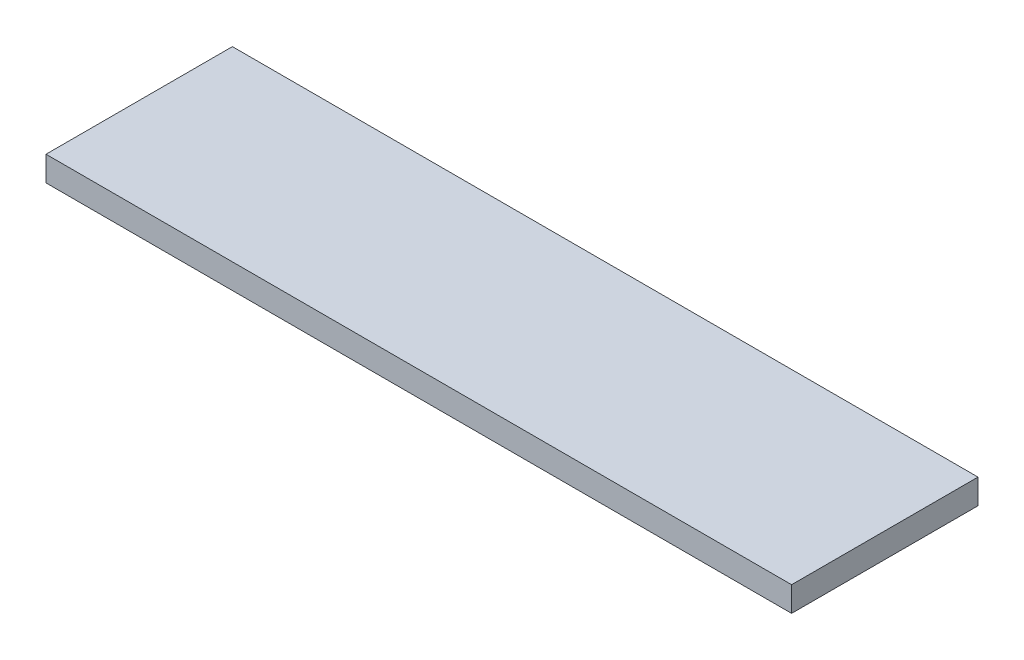
ISO-10303-21;
HEADER;
FILE_DESCRIPTION(('STEP AP214'),'2;1');
FILE_NAME('part.step','',(''),(''),'','','');
FILE_SCHEMA(('AUTOMOTIVE_DESIGN { 1 0 10303 214 1 1 1 1 }'));
ENDSEC;
DATA;
#1=APPLICATION_CONTEXT('core data for automotive mechanical design processes');
#2=APPLICATION_PROTOCOL_DEFINITION('international standard','automotive_design',2000,#1);
#3=PRODUCT_CONTEXT('',#1,'mechanical');
#4=PRODUCT('Part','Part','',(#3));
#5=PRODUCT_RELATED_PRODUCT_CATEGORY('part','',(#4));
#6=PRODUCT_DEFINITION_FORMATION('','',#4);
#7=PRODUCT_DEFINITION_CONTEXT('part definition',#1,'design');
#8=PRODUCT_DEFINITION('design','',#6,#7);
#9=PRODUCT_DEFINITION_SHAPE('','',#8);
#10=(LENGTH_UNIT() NAMED_UNIT(*) SI_UNIT(.MILLI.,.METRE.));
#11=(NAMED_UNIT(*) PLANE_ANGLE_UNIT() SI_UNIT($,.RADIAN.));
#12=(NAMED_UNIT(*) SI_UNIT($,.STERADIAN.) SOLID_ANGLE_UNIT());
#13=UNCERTAINTY_MEASURE_WITH_UNIT(LENGTH_MEASURE(1.E-05),#10,'distance_accuracy_value','');
#14=(GEOMETRIC_REPRESENTATION_CONTEXT(3) GLOBAL_UNCERTAINTY_ASSIGNED_CONTEXT((#13)) GLOBAL_UNIT_ASSIGNED_CONTEXT((#10,
#11,#12)) REPRESENTATION_CONTEXT('',''));
#15=CARTESIAN_POINT('',(0.,0.,0.));
#16=DIRECTION('',(0.,0.,1.));
#17=DIRECTION('',(1.,0.,0.));
#18=AXIS2_PLACEMENT_3D('',#15,#16,#17);
#19=CARTESIAN_POINT('',(30.,2.,7.5));
#20=DIRECTION('',(-1.,0.,0.));
#21=DIRECTION('',(0.,0.,1.));
#22=AXIS2_PLACEMENT_3D('',#19,#20,#21);
#23=PLANE('',#22);
#24=DIRECTION('',(0.,0.,-1.));
#25=VECTOR('',#24,1.);
#26=CARTESIAN_POINT('',(30.,0.,7.5));
#27=LINE('',#26,#25);
#28=CARTESIAN_POINT('',(30.,0.,7.5));
#29=VERTEX_POINT('',#28);
#30=CARTESIAN_POINT('',(30.,0.,-7.5));
#31=VERTEX_POINT('',#30);
#32=EDGE_CURVE('E113',#29,#31,#27,.T.);
#33=ORIENTED_EDGE('',*,*,#32,.T.);
#34=DIRECTION('',(0.,-1.,0.));
#35=VECTOR('',#34,1.);
#36=CARTESIAN_POINT('',(30.,2.,-7.5));
#37=LINE('',#36,#35);
#38=CARTESIAN_POINT('',(30.,2.,-7.5));
#39=VERTEX_POINT('',#38);
#40=EDGE_CURVE('E11',#39,#31,#37,.T.);
#41=ORIENTED_EDGE('',*,*,#40,.F.);
#42=DIRECTION('',(0.,0.,-1.));
#43=VECTOR('',#42,1.);
#44=CARTESIAN_POINT('',(30.,2.,7.5));
#45=LINE('',#44,#43);
#46=CARTESIAN_POINT('',(30.,2.,7.5));
#47=VERTEX_POINT('',#46);
#48=EDGE_CURVE('E97',#47,#39,#45,.T.);
#49=ORIENTED_EDGE('',*,*,#48,.F.);
#50=DIRECTION('',(0.,-1.,0.));
#51=VECTOR('',#50,1.);
#52=CARTESIAN_POINT('',(30.,2.,7.5));
#53=LINE('',#52,#51);
#54=EDGE_CURVE('E109',#47,#29,#53,.T.);
#55=ORIENTED_EDGE('',*,*,#54,.T.);
#56=EDGE_LOOP('',(#33,#41,#49,#55));
#57=FACE_BOUND('',#56,.T.);
#58=ADVANCED_FACE('F45',(#57),#23,.F.);
#59=CARTESIAN_POINT('',(-30.,2.,-7.5));
#60=DIRECTION('',(0.,0.,1.));
#61=DIRECTION('',(1.,0.,0.));
#62=AXIS2_PLACEMENT_3D('',#59,#60,#61);
#63=PLANE('',#62);
#64=DIRECTION('',(-1.,0.,0.));
#65=VECTOR('',#64,1.);
#66=CARTESIAN_POINT('',(-30.,0.,-7.5));
#67=LINE('',#66,#65);
#68=CARTESIAN_POINT('',(-30.,0.,-7.5));
#69=VERTEX_POINT('',#68);
#70=EDGE_CURVE('E102',#31,#69,#67,.T.);
#71=ORIENTED_EDGE('',*,*,#70,.T.);
#72=DIRECTION('',(0.,-1.,0.));
#73=VECTOR('',#72,1.);
#74=CARTESIAN_POINT('',(-30.,2.,-7.5));
#75=LINE('',#74,#73);
#76=CARTESIAN_POINT('',(-30.,2.,-7.5));
#77=VERTEX_POINT('',#76);
#78=EDGE_CURVE('E54',#77,#69,#75,.T.);
#79=ORIENTED_EDGE('',*,*,#78,.F.);
#80=DIRECTION('',(-1.,0.,0.));
#81=VECTOR('',#80,1.);
#82=CARTESIAN_POINT('',(-30.,2.,-7.5));
#83=LINE('',#82,#81);
#84=EDGE_CURVE('E92',#39,#77,#83,.T.);
#85=ORIENTED_EDGE('',*,*,#84,.F.);
#86=ORIENTED_EDGE('',*,*,#40,.T.);
#87=EDGE_LOOP('',(#71,#79,#85,#86));
#88=FACE_BOUND('',#87,.T.);
#89=ADVANCED_FACE('F101',(#88),#63,.F.);
#90=CARTESIAN_POINT('',(-30.,2.,7.5));
#91=DIRECTION('',(1.,0.,0.));
#92=DIRECTION('',(0.,0.,-1.));
#93=AXIS2_PLACEMENT_3D('',#90,#91,#92);
#94=PLANE('',#93);
#95=DIRECTION('',(0.,0.,1.));
#96=VECTOR('',#95,1.);
#97=CARTESIAN_POINT('',(-30.,0.,7.5));
#98=LINE('',#97,#96);
#99=CARTESIAN_POINT('',(-30.,0.,7.5));
#100=VERTEX_POINT('',#99);
#101=EDGE_CURVE('E79',#69,#100,#98,.T.);
#102=ORIENTED_EDGE('',*,*,#101,.T.);
#103=DIRECTION('',(0.,-1.,0.));
#104=VECTOR('',#103,1.);
#105=CARTESIAN_POINT('',(-30.,2.,7.5));
#106=LINE('',#105,#104);
#107=CARTESIAN_POINT('',(-30.,2.,7.5));
#108=VERTEX_POINT('',#107);
#109=EDGE_CURVE('E104',#108,#100,#106,.T.);
#110=ORIENTED_EDGE('',*,*,#109,.F.);
#111=DIRECTION('',(0.,0.,1.));
#112=VECTOR('',#111,1.);
#113=CARTESIAN_POINT('',(-30.,2.,7.5));
#114=LINE('',#113,#112);
#115=EDGE_CURVE('E95',#77,#108,#114,.T.);
#116=ORIENTED_EDGE('',*,*,#115,.F.);
#117=ORIENTED_EDGE('',*,*,#78,.T.);
#118=EDGE_LOOP('',(#102,#110,#116,#117));
#119=FACE_BOUND('',#118,.T.);
#120=ADVANCED_FACE('F105',(#119),#94,.F.);
#121=CARTESIAN_POINT('',(-30.,2.,7.5));
#122=DIRECTION('',(0.,0.,-1.));
#123=DIRECTION('',(-1.,0.,0.));
#124=AXIS2_PLACEMENT_3D('',#121,#122,#123);
#125=PLANE('',#124);
#126=DIRECTION('',(1.,0.,0.));
#127=VECTOR('',#126,1.);
#128=CARTESIAN_POINT('',(-30.,0.,7.5));
#129=LINE('',#128,#127);
#130=EDGE_CURVE('E85',#100,#29,#129,.T.);
#131=ORIENTED_EDGE('',*,*,#130,.T.);
#132=ORIENTED_EDGE('',*,*,#54,.F.);
#133=DIRECTION('',(1.,0.,0.));
#134=VECTOR('',#133,1.);
#135=CARTESIAN_POINT('',(-30.,2.,7.5));
#136=LINE('',#135,#134);
#137=EDGE_CURVE('E62',#108,#47,#136,.T.);
#138=ORIENTED_EDGE('',*,*,#137,.F.);
#139=ORIENTED_EDGE('',*,*,#109,.T.);
#140=EDGE_LOOP('',(#131,#132,#138,#139));
#141=FACE_BOUND('',#140,.T.);
#142=ADVANCED_FACE('F126',(#141),#125,.F.);
#143=CARTESIAN_POINT('',(0.,2.,0.));
#144=DIRECTION('',(0.,-1.,0.));
#145=DIRECTION('',(0.,0.,-1.));
#146=AXIS2_PLACEMENT_3D('',#143,#144,#145);
#147=PLANE('',#146);
#148=ORIENTED_EDGE('',*,*,#48,.T.);
#149=ORIENTED_EDGE('',*,*,#84,.T.);
#150=ORIENTED_EDGE('',*,*,#115,.T.);
#151=ORIENTED_EDGE('',*,*,#137,.T.);
#152=EDGE_LOOP('',(#148,#149,#150,#151));
#153=FACE_BOUND('',#152,.T.);
#154=ADVANCED_FACE('F93',(#153),#147,.F.);
#155=CARTESIAN_POINT('',(0.,0.,0.));
#156=DIRECTION('',(0.,-1.,0.));
#157=DIRECTION('',(0.,0.,-1.));
#158=AXIS2_PLACEMENT_3D('',#155,#156,#157);
#159=PLANE('',#158);
#160=ORIENTED_EDGE('',*,*,#32,.F.);
#161=ORIENTED_EDGE('',*,*,#130,.F.);
#162=ORIENTED_EDGE('',*,*,#101,.F.);
#163=ORIENTED_EDGE('',*,*,#70,.F.);
#164=EDGE_LOOP('',(#160,#161,#162,#163));
#165=FACE_BOUND('',#164,.T.);
#166=ADVANCED_FACE('F129',(#165),#159,.T.);
#167=CLOSED_SHELL('',(#58,#89,#120,#142,#154,#166));
#168=MANIFOLD_SOLID_BREP('B2',#167);
#169=ADVANCED_BREP_SHAPE_REPRESENTATION('',(#18,#168),#14);
#170=SHAPE_DEFINITION_REPRESENTATION(#9,#169);
ENDSEC;
END-ISO-10303-21;
